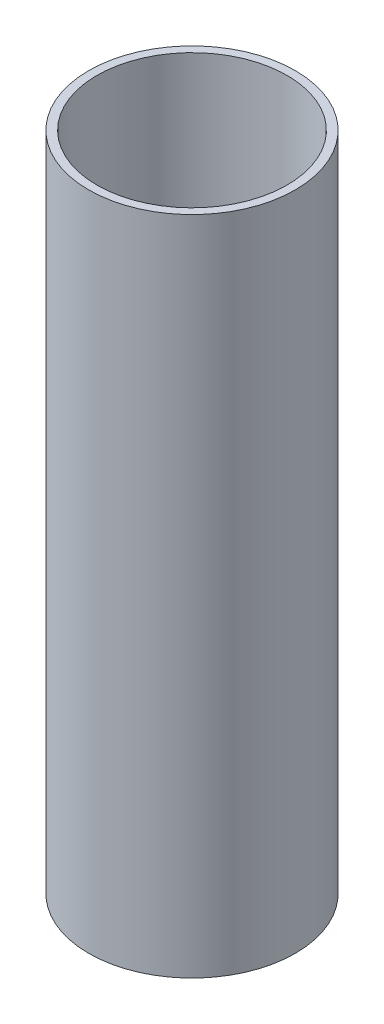
ISO-10303-21;
HEADER;
FILE_DESCRIPTION(('STEP AP214'),'2;1');
FILE_NAME('part.step','',(''),(''),'','','');
FILE_SCHEMA(('AUTOMOTIVE_DESIGN { 1 0 10303 214 1 1 1 1 }'));
ENDSEC;
DATA;
#1=APPLICATION_CONTEXT('core data for automotive mechanical design processes');
#2=APPLICATION_PROTOCOL_DEFINITION('international standard','automotive_design',2000,#1);
#3=PRODUCT_CONTEXT('',#1,'mechanical');
#4=PRODUCT('Part','Part','',(#3));
#5=PRODUCT_RELATED_PRODUCT_CATEGORY('part','',(#4));
#6=PRODUCT_DEFINITION_FORMATION('','',#4);
#7=PRODUCT_DEFINITION_CONTEXT('part definition',#1,'design');
#8=PRODUCT_DEFINITION('design','',#6,#7);
#9=PRODUCT_DEFINITION_SHAPE('','',#8);
#10=(LENGTH_UNIT() NAMED_UNIT(*) SI_UNIT(.MILLI.,.METRE.));
#11=(NAMED_UNIT(*) PLANE_ANGLE_UNIT() SI_UNIT($,.RADIAN.));
#12=(NAMED_UNIT(*) SI_UNIT($,.STERADIAN.) SOLID_ANGLE_UNIT());
#13=UNCERTAINTY_MEASURE_WITH_UNIT(LENGTH_MEASURE(1.E-05),#10,'distance_accuracy_value','');
#14=(GEOMETRIC_REPRESENTATION_CONTEXT(3) GLOBAL_UNCERTAINTY_ASSIGNED_CONTEXT((#13)) GLOBAL_UNIT_ASSIGNED_CONTEXT((#10,
#11,#12)) REPRESENTATION_CONTEXT('',''));
#15=CARTESIAN_POINT('',(0.,0.,0.));
#16=DIRECTION('',(0.,0.,1.));
#17=DIRECTION('',(1.,0.,0.));
#18=AXIS2_PLACEMENT_3D('',#15,#16,#17);
#19=CARTESIAN_POINT('',(0.,80.,0.));
#20=DIRECTION('',(0.,1.,0.));
#21=DIRECTION('',(0.,0.,1.));
#22=AXIS2_PLACEMENT_3D('',#19,#20,#21);
#23=PLANE('',#22);
#24=CARTESIAN_POINT('',(0.,80.,0.));
#25=DIRECTION('',(0.,1.,0.));
#26=DIRECTION('',(0.,0.,1.));
#27=AXIS2_PLACEMENT_3D('',#24,#25,#26);
#28=CIRCLE('',#27,12.5);
#29=CARTESIAN_POINT('',(0.,80.,12.5));
#30=VERTEX_POINT('',#29);
#31=EDGE_CURVE('E10',#30,#30,#28,.T.);
#32=ORIENTED_EDGE('',*,*,#31,.T.);
#33=EDGE_LOOP('',(#32));
#34=FACE_BOUND('',#33,.T.);
#35=CARTESIAN_POINT('',(0.,80.,0.));
#36=DIRECTION('',(0.,1.,0.));
#37=DIRECTION('',(0.,0.,1.));
#38=AXIS2_PLACEMENT_3D('',#35,#36,#37);
#39=CIRCLE('',#38,11.5);
#40=CARTESIAN_POINT('',(0.,80.,11.5));
#41=VERTEX_POINT('',#40);
#42=EDGE_CURVE('E48',#41,#41,#39,.T.);
#43=ORIENTED_EDGE('',*,*,#42,.F.);
#44=EDGE_LOOP('',(#43));
#45=FACE_BOUND('',#44,.T.);
#46=ADVANCED_FACE('F37',(#34,#45),#23,.T.);
#47=CARTESIAN_POINT('',(0.,0.,0.));
#48=DIRECTION('',(0.,1.,0.));
#49=DIRECTION('',(0.,0.,1.));
#50=AXIS2_PLACEMENT_3D('',#47,#48,#49);
#51=PLANE('',#50);
#52=CARTESIAN_POINT('',(0.,0.,0.));
#53=DIRECTION('',(0.,1.,0.));
#54=DIRECTION('',(0.,0.,1.));
#55=AXIS2_PLACEMENT_3D('',#52,#53,#54);
#56=CIRCLE('',#55,12.5);
#57=CARTESIAN_POINT('',(0.,0.,12.5));
#58=VERTEX_POINT('',#57);
#59=EDGE_CURVE('E41',#58,#58,#56,.T.);
#60=ORIENTED_EDGE('',*,*,#59,.F.);
#61=EDGE_LOOP('',(#60));
#62=FACE_BOUND('',#61,.T.);
#63=CARTESIAN_POINT('',(0.,0.,0.));
#64=DIRECTION('',(0.,1.,0.));
#65=DIRECTION('',(0.,0.,1.));
#66=AXIS2_PLACEMENT_3D('',#63,#64,#65);
#67=CIRCLE('',#66,11.5);
#68=CARTESIAN_POINT('',(0.,0.,11.5));
#69=VERTEX_POINT('',#68);
#70=EDGE_CURVE('E50',#69,#69,#67,.T.);
#71=ORIENTED_EDGE('',*,*,#70,.T.);
#72=EDGE_LOOP('',(#71));
#73=FACE_BOUND('',#72,.T.);
#74=ADVANCED_FACE('F60',(#62,#73),#51,.F.);
#75=CARTESIAN_POINT('',(0.,80.,0.));
#76=DIRECTION('',(0.,-1.,0.));
#77=DIRECTION('',(0.,0.,-1.));
#78=AXIS2_PLACEMENT_3D('',#75,#76,#77);
#79=CYLINDRICAL_SURFACE('',#78,12.5);
#80=ORIENTED_EDGE('',*,*,#31,.F.);
#81=EDGE_LOOP('',(#80));
#82=FACE_BOUND('',#81,.T.);
#83=ORIENTED_EDGE('',*,*,#59,.T.);
#84=EDGE_LOOP('',(#83));
#85=FACE_BOUND('',#84,.T.);
#86=ADVANCED_FACE('F39',(#82,#85),#79,.T.);
#87=CARTESIAN_POINT('',(0.,80.,0.));
#88=DIRECTION('',(0.,-1.,0.));
#89=DIRECTION('',(0.,0.,-1.));
#90=AXIS2_PLACEMENT_3D('',#87,#88,#89);
#91=CYLINDRICAL_SURFACE('',#90,11.5);
#92=ORIENTED_EDGE('',*,*,#42,.T.);
#93=EDGE_LOOP('',(#92));
#94=FACE_BOUND('',#93,.T.);
#95=ORIENTED_EDGE('',*,*,#70,.F.);
#96=EDGE_LOOP('',(#95));
#97=FACE_BOUND('',#96,.T.);
#98=ADVANCED_FACE('F56',(#94,#97),#91,.F.);
#99=CLOSED_SHELL('',(#46,#74,#86,#98));
#100=MANIFOLD_SOLID_BREP('B2',#99);
#101=ADVANCED_BREP_SHAPE_REPRESENTATION('',(#18,#100),#14);
#102=SHAPE_DEFINITION_REPRESENTATION(#9,#101);
ENDSEC;
END-ISO-10303-21;
